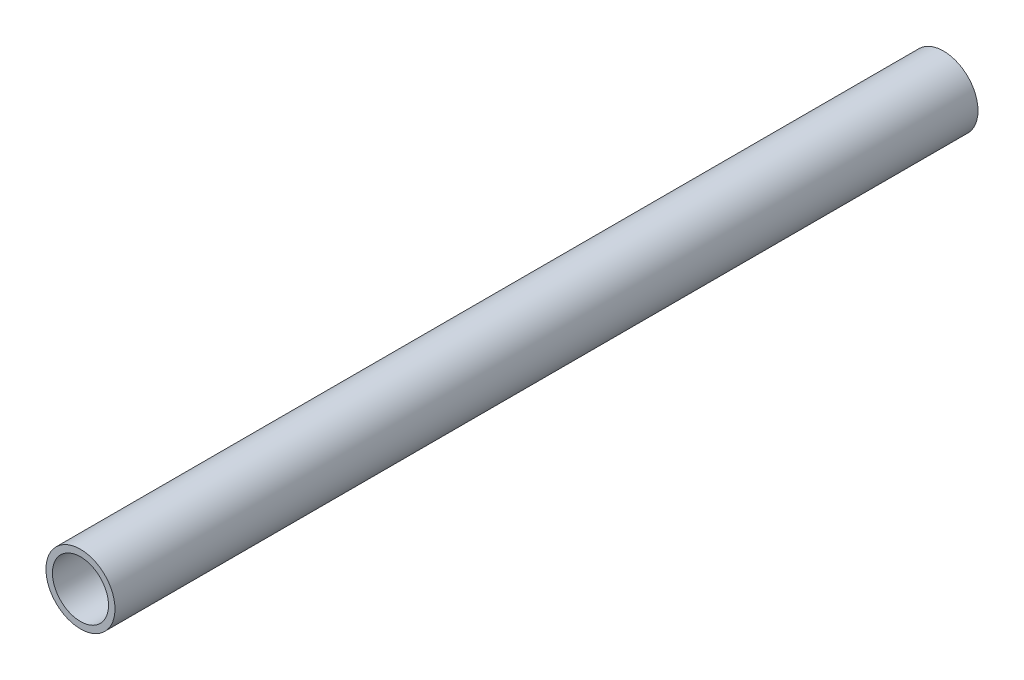
ISO-10303-21;
HEADER;
FILE_DESCRIPTION(('STEP AP214'),'2;1');
FILE_NAME('part.step','',(''),(''),'','','');
FILE_SCHEMA(('AUTOMOTIVE_DESIGN { 1 0 10303 214 1 1 1 1 }'));
ENDSEC;
DATA;
#1=APPLICATION_CONTEXT('core data for automotive mechanical design processes');
#2=APPLICATION_PROTOCOL_DEFINITION('international standard','automotive_design',2000,#1);
#3=PRODUCT_CONTEXT('',#1,'mechanical');
#4=PRODUCT('Part','Part','',(#3));
#5=PRODUCT_RELATED_PRODUCT_CATEGORY('part','',(#4));
#6=PRODUCT_DEFINITION_FORMATION('','',#4);
#7=PRODUCT_DEFINITION_CONTEXT('part definition',#1,'design');
#8=PRODUCT_DEFINITION('design','',#6,#7);
#9=PRODUCT_DEFINITION_SHAPE('','',#8);
#10=(LENGTH_UNIT() NAMED_UNIT(*) SI_UNIT(.MILLI.,.METRE.));
#11=(NAMED_UNIT(*) PLANE_ANGLE_UNIT() SI_UNIT($,.RADIAN.));
#12=(NAMED_UNIT(*) SI_UNIT($,.STERADIAN.) SOLID_ANGLE_UNIT());
#13=UNCERTAINTY_MEASURE_WITH_UNIT(LENGTH_MEASURE(1.E-05),#10,'distance_accuracy_value','');
#14=(GEOMETRIC_REPRESENTATION_CONTEXT(3) GLOBAL_UNCERTAINTY_ASSIGNED_CONTEXT((#13)) GLOBAL_UNIT_ASSIGNED_CONTEXT((#10,
#11,#12)) REPRESENTATION_CONTEXT('',''));
#15=CARTESIAN_POINT('',(0.,0.,0.));
#16=DIRECTION('',(0.,0.,1.));
#17=DIRECTION('',(1.,0.,0.));
#18=AXIS2_PLACEMENT_3D('',#15,#16,#17);
#19=CARTESIAN_POINT('',(0.,0.,200.));
#20=DIRECTION('',(0.,0.,-1.));
#21=DIRECTION('',(-1.,0.,0.));
#22=AXIS2_PLACEMENT_3D('',#19,#20,#21);
#23=CYLINDRICAL_SURFACE('',#22,16.);
#24=CARTESIAN_POINT('',(0.,0.,200.));
#25=DIRECTION('',(0.,0.,1.));
#26=DIRECTION('',(1.,0.,0.));
#27=AXIS2_PLACEMENT_3D('',#24,#25,#26);
#28=CIRCLE('',#27,16.);
#29=CARTESIAN_POINT('',(16.,0.,200.));
#30=VERTEX_POINT('',#29);
#31=EDGE_CURVE('E10',#30,#30,#28,.T.);
#32=ORIENTED_EDGE('',*,*,#31,.F.);
#33=EDGE_LOOP('',(#32));
#34=FACE_BOUND('',#33,.T.);
#35=CARTESIAN_POINT('',(0.,0.,-200.));
#36=DIRECTION('',(0.,0.,1.));
#37=DIRECTION('',(1.,0.,0.));
#38=AXIS2_PLACEMENT_3D('',#35,#36,#37);
#39=CIRCLE('',#38,16.);
#40=CARTESIAN_POINT('',(16.,0.,-200.));
#41=VERTEX_POINT('',#40);
#42=EDGE_CURVE('E36',#41,#41,#39,.T.);
#43=ORIENTED_EDGE('',*,*,#42,.T.);
#44=EDGE_LOOP('',(#43));
#45=FACE_BOUND('',#44,.T.);
#46=ADVANCED_FACE('F33',(#34,#45),#23,.T.);
#47=CARTESIAN_POINT('',(0.,0.,200.));
#48=DIRECTION('',(0.,0.,1.));
#49=DIRECTION('',(1.,0.,0.));
#50=AXIS2_PLACEMENT_3D('',#47,#48,#49);
#51=PLANE('',#50);
#52=CARTESIAN_POINT('',(0.,0.,200.));
#53=DIRECTION('',(0.,0.,1.));
#54=DIRECTION('',(1.,0.,0.));
#55=AXIS2_PLACEMENT_3D('',#52,#53,#54);
#56=CIRCLE('',#55,13.);
#57=CARTESIAN_POINT('',(13.,0.,200.));
#58=VERTEX_POINT('',#57);
#59=EDGE_CURVE('E43',#58,#58,#56,.T.);
#60=ORIENTED_EDGE('',*,*,#59,.F.);
#61=EDGE_LOOP('',(#60));
#62=FACE_BOUND('',#61,.T.);
#63=ORIENTED_EDGE('',*,*,#31,.T.);
#64=EDGE_LOOP('',(#63));
#65=FACE_BOUND('',#64,.T.);
#66=ADVANCED_FACE('F54',(#62,#65),#51,.T.);
#67=CARTESIAN_POINT('',(0.,0.,-200.));
#68=DIRECTION('',(0.,0.,1.));
#69=DIRECTION('',(1.,0.,0.));
#70=AXIS2_PLACEMENT_3D('',#67,#68,#69);
#71=PLANE('',#70);
#72=CARTESIAN_POINT('',(0.,0.,-200.));
#73=DIRECTION('',(0.,0.,1.));
#74=DIRECTION('',(1.,0.,0.));
#75=AXIS2_PLACEMENT_3D('',#72,#73,#74);
#76=CIRCLE('',#75,13.);
#77=CARTESIAN_POINT('',(13.,0.,-200.));
#78=VERTEX_POINT('',#77);
#79=EDGE_CURVE('E45',#78,#78,#76,.T.);
#80=ORIENTED_EDGE('',*,*,#79,.T.);
#81=EDGE_LOOP('',(#80));
#82=FACE_BOUND('',#81,.T.);
#83=ORIENTED_EDGE('',*,*,#42,.F.);
#84=EDGE_LOOP('',(#83));
#85=FACE_BOUND('',#84,.T.);
#86=ADVANCED_FACE('F56',(#82,#85),#71,.F.);
#87=CARTESIAN_POINT('',(0.,0.,200.));
#88=DIRECTION('',(0.,0.,-1.));
#89=DIRECTION('',(-1.,0.,0.));
#90=AXIS2_PLACEMENT_3D('',#87,#88,#89);
#91=CYLINDRICAL_SURFACE('',#90,13.);
#92=ORIENTED_EDGE('',*,*,#59,.T.);
#93=EDGE_LOOP('',(#92));
#94=FACE_BOUND('',#93,.T.);
#95=ORIENTED_EDGE('',*,*,#79,.F.);
#96=EDGE_LOOP('',(#95));
#97=FACE_BOUND('',#96,.T.);
#98=ADVANCED_FACE('F51',(#94,#97),#91,.F.);
#99=CLOSED_SHELL('',(#46,#66,#86,#98));
#100=MANIFOLD_SOLID_BREP('B2',#99);
#101=ADVANCED_BREP_SHAPE_REPRESENTATION('',(#18,#100),#14);
#102=SHAPE_DEFINITION_REPRESENTATION(#9,#101);
ENDSEC;
END-ISO-10303-21;
